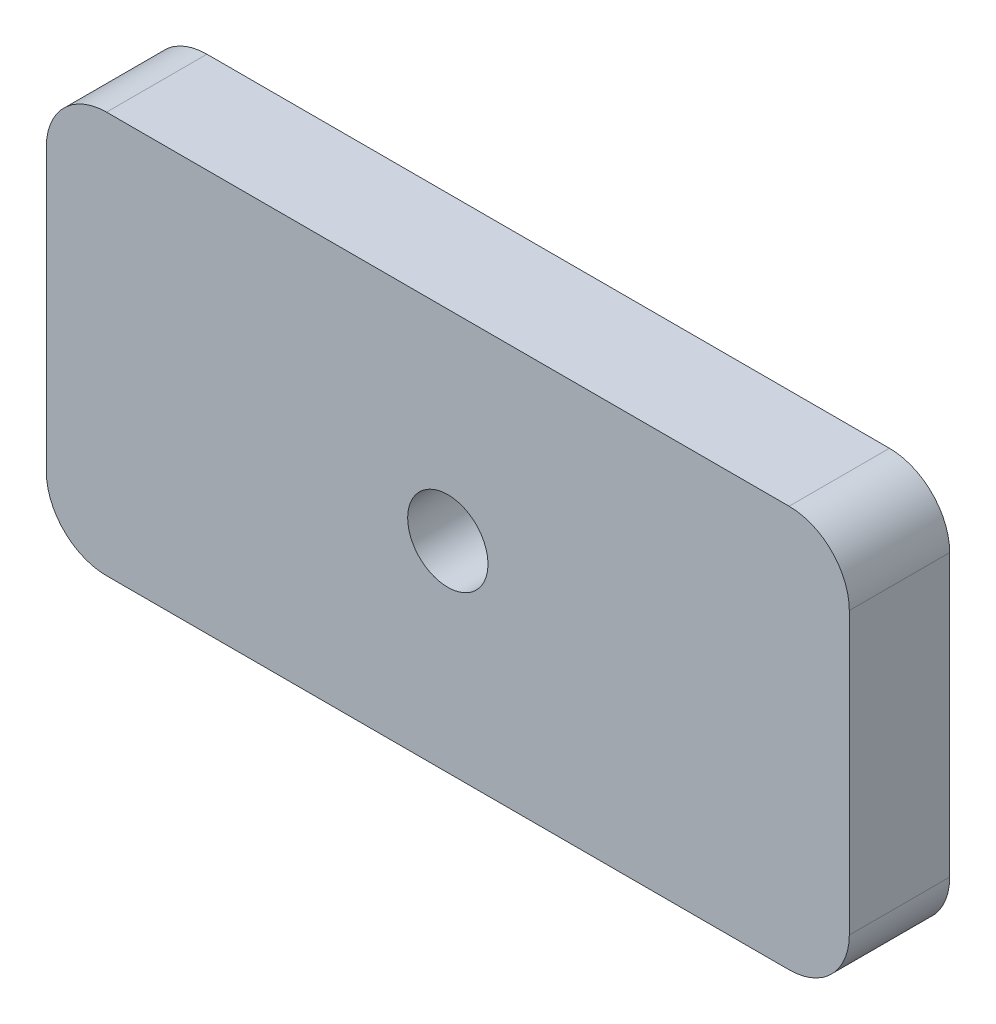
ISO-10303-21;
HEADER;
FILE_DESCRIPTION(('STEP AP214'),'2;1');
FILE_NAME('part.step','',(''),(''),'','','');
FILE_SCHEMA(('AUTOMOTIVE_DESIGN { 1 0 10303 214 1 1 1 1 }'));
ENDSEC;
DATA;
#1=APPLICATION_CONTEXT('core data for automotive mechanical design processes');
#2=APPLICATION_PROTOCOL_DEFINITION('international standard','automotive_design',2000,#1);
#3=PRODUCT_CONTEXT('',#1,'mechanical');
#4=PRODUCT('Part','Part','',(#3));
#5=PRODUCT_RELATED_PRODUCT_CATEGORY('part','',(#4));
#6=PRODUCT_DEFINITION_FORMATION('','',#4);
#7=PRODUCT_DEFINITION_CONTEXT('part definition',#1,'design');
#8=PRODUCT_DEFINITION('design','',#6,#7);
#9=PRODUCT_DEFINITION_SHAPE('','',#8);
#10=(LENGTH_UNIT() NAMED_UNIT(*) SI_UNIT(.MILLI.,.METRE.));
#11=(NAMED_UNIT(*) PLANE_ANGLE_UNIT() SI_UNIT($,.RADIAN.));
#12=(NAMED_UNIT(*) SI_UNIT($,.STERADIAN.) SOLID_ANGLE_UNIT());
#13=UNCERTAINTY_MEASURE_WITH_UNIT(LENGTH_MEASURE(1.E-05),#10,'distance_accuracy_value','');
#14=(GEOMETRIC_REPRESENTATION_CONTEXT(3) GLOBAL_UNCERTAINTY_ASSIGNED_CONTEXT((#13)) GLOBAL_UNIT_ASSIGNED_CONTEXT((#10,
#11,#12)) REPRESENTATION_CONTEXT('',''));
#15=CARTESIAN_POINT('',(0.,0.,0.));
#16=DIRECTION('',(0.,0.,1.));
#17=DIRECTION('',(1.,0.,0.));
#18=AXIS2_PLACEMENT_3D('',#15,#16,#17);
#19=CARTESIAN_POINT('',(-17.,-7.00000000000001,5.));
#20=DIRECTION('',(0.,0.,-1.));
#21=DIRECTION('',(-1.,0.,0.));
#22=AXIS2_PLACEMENT_3D('',#19,#20,#21);
#23=CYLINDRICAL_SURFACE('',#22,3.);
#24=CARTESIAN_POINT('',(-17.,-7.00000000000001,0.));
#25=DIRECTION('',(0.,0.,1.));
#26=DIRECTION('',(-1.,0.,0.));
#27=AXIS2_PLACEMENT_3D('',#24,#25,#26);
#28=CIRCLE('',#27,3.);
#29=CARTESIAN_POINT('',(-20.,-7.00000000000001,0.));
#30=VERTEX_POINT('',#29);
#31=CARTESIAN_POINT('',(-17.,-10.,0.));
#32=VERTEX_POINT('',#31);
#33=EDGE_CURVE('E140',#30,#32,#28,.T.);
#34=ORIENTED_EDGE('',*,*,#33,.T.);
#35=DIRECTION('',(0.,0.,-1.));
#36=VECTOR('',#35,1.);
#37=CARTESIAN_POINT('',(-17.,-10.,5.));
#38=LINE('',#37,#36);
#39=CARTESIAN_POINT('',(-17.,-10.,5.));
#40=VERTEX_POINT('',#39);
#41=EDGE_CURVE('E11',#40,#32,#38,.T.);
#42=ORIENTED_EDGE('',*,*,#41,.F.);
#43=CARTESIAN_POINT('',(-17.,-7.00000000000001,5.));
#44=DIRECTION('',(0.,0.,1.));
#45=DIRECTION('',(-1.,0.,0.));
#46=AXIS2_PLACEMENT_3D('',#43,#44,#45);
#47=CIRCLE('',#46,3.);
#48=CARTESIAN_POINT('',(-20.,-7.00000000000001,5.));
#49=VERTEX_POINT('',#48);
#50=EDGE_CURVE('E163',#49,#40,#47,.T.);
#51=ORIENTED_EDGE('',*,*,#50,.F.);
#52=DIRECTION('',(0.,0.,-1.));
#53=VECTOR('',#52,1.);
#54=CARTESIAN_POINT('',(-20.,-7.00000000000001,5.));
#55=LINE('',#54,#53);
#56=EDGE_CURVE('E136',#49,#30,#55,.T.);
#57=ORIENTED_EDGE('',*,*,#56,.T.);
#58=EDGE_LOOP('',(#34,#42,#51,#57));
#59=FACE_BOUND('',#58,.T.);
#60=ADVANCED_FACE('F39',(#59),#23,.T.);
#61=CARTESIAN_POINT('',(17.,-10.,5.));
#62=DIRECTION('',(0.,1.,0.));
#63=DIRECTION('',(-1.,0.,0.));
#64=AXIS2_PLACEMENT_3D('',#61,#62,#63);
#65=PLANE('',#64);
#66=DIRECTION('',(1.,0.,0.));
#67=VECTOR('',#66,1.);
#68=CARTESIAN_POINT('',(17.,-10.,0.));
#69=LINE('',#68,#67);
#70=CARTESIAN_POINT('',(17.,-10.,0.));
#71=VERTEX_POINT('',#70);
#72=EDGE_CURVE('E144',#32,#71,#69,.T.);
#73=ORIENTED_EDGE('',*,*,#72,.T.);
#74=DIRECTION('',(0.,0.,-1.));
#75=VECTOR('',#74,1.);
#76=CARTESIAN_POINT('',(17.,-10.,5.));
#77=LINE('',#76,#75);
#78=CARTESIAN_POINT('',(17.,-10.,5.));
#79=VERTEX_POINT('',#78);
#80=EDGE_CURVE('E48',#79,#71,#77,.T.);
#81=ORIENTED_EDGE('',*,*,#80,.F.);
#82=DIRECTION('',(1.,0.,0.));
#83=VECTOR('',#82,1.);
#84=CARTESIAN_POINT('',(17.,-10.,5.));
#85=LINE('',#84,#83);
#86=EDGE_CURVE('E99',#40,#79,#85,.T.);
#87=ORIENTED_EDGE('',*,*,#86,.F.);
#88=ORIENTED_EDGE('',*,*,#41,.T.);
#89=EDGE_LOOP('',(#73,#81,#87,#88));
#90=FACE_BOUND('',#89,.T.);
#91=ADVANCED_FACE('F230',(#90),#65,.F.);
#92=CARTESIAN_POINT('',(17.,-7.00000000000001,5.));
#93=DIRECTION('',(0.,0.,-1.));
#94=DIRECTION('',(-1.,0.,0.));
#95=AXIS2_PLACEMENT_3D('',#92,#93,#94);
#96=CYLINDRICAL_SURFACE('',#95,2.99999999999999);
#97=CARTESIAN_POINT('',(17.,-7.00000000000001,0.));
#98=DIRECTION('',(0.,0.,1.));
#99=DIRECTION('',(-1.,0.,0.));
#100=AXIS2_PLACEMENT_3D('',#97,#98,#99);
#101=CIRCLE('',#100,2.99999999999999);
#102=CARTESIAN_POINT('',(20.,-7.00000000000001,0.));
#103=VERTEX_POINT('',#102);
#104=EDGE_CURVE('E148',#71,#103,#101,.T.);
#105=ORIENTED_EDGE('',*,*,#104,.T.);
#106=DIRECTION('',(0.,0.,-1.));
#107=VECTOR('',#106,1.);
#108=CARTESIAN_POINT('',(20.,-7.00000000000001,5.));
#109=LINE('',#108,#107);
#110=CARTESIAN_POINT('',(20.,-7.00000000000001,5.));
#111=VERTEX_POINT('',#110);
#112=EDGE_CURVE('E174',#111,#103,#109,.T.);
#113=ORIENTED_EDGE('',*,*,#112,.F.);
#114=CARTESIAN_POINT('',(17.,-7.00000000000001,5.));
#115=DIRECTION('',(0.,0.,1.));
#116=DIRECTION('',(-1.,0.,0.));
#117=AXIS2_PLACEMENT_3D('',#114,#115,#116);
#118=CIRCLE('',#117,2.99999999999999);
#119=EDGE_CURVE('E184',#79,#111,#118,.T.);
#120=ORIENTED_EDGE('',*,*,#119,.F.);
#121=ORIENTED_EDGE('',*,*,#80,.T.);
#122=EDGE_LOOP('',(#105,#113,#120,#121));
#123=FACE_BOUND('',#122,.T.);
#124=ADVANCED_FACE('F182',(#123),#96,.T.);
#125=CARTESIAN_POINT('',(20.,7.00000000000001,5.));
#126=DIRECTION('',(-1.,0.,0.));
#127=DIRECTION('',(0.,0.,1.));
#128=AXIS2_PLACEMENT_3D('',#125,#126,#127);
#129=PLANE('',#128);
#130=DIRECTION('',(0.,1.,0.));
#131=VECTOR('',#130,1.);
#132=CARTESIAN_POINT('',(20.,7.00000000000001,0.));
#133=LINE('',#132,#131);
#134=CARTESIAN_POINT('',(20.,7.00000000000001,0.));
#135=VERTEX_POINT('',#134);
#136=EDGE_CURVE('E151',#103,#135,#133,.T.);
#137=ORIENTED_EDGE('',*,*,#136,.T.);
#138=DIRECTION('',(0.,0.,-1.));
#139=VECTOR('',#138,1.);
#140=CARTESIAN_POINT('',(20.,7.00000000000001,5.));
#141=LINE('',#140,#139);
#142=CARTESIAN_POINT('',(20.,7.00000000000001,5.));
#143=VERTEX_POINT('',#142);
#144=EDGE_CURVE('E170',#143,#135,#141,.T.);
#145=ORIENTED_EDGE('',*,*,#144,.F.);
#146=DIRECTION('',(0.,1.,0.));
#147=VECTOR('',#146,1.);
#148=CARTESIAN_POINT('',(20.,7.00000000000001,5.));
#149=LINE('',#148,#147);
#150=EDGE_CURVE('E197',#111,#143,#149,.T.);
#151=ORIENTED_EDGE('',*,*,#150,.F.);
#152=ORIENTED_EDGE('',*,*,#112,.T.);
#153=EDGE_LOOP('',(#137,#145,#151,#152));
#154=FACE_BOUND('',#153,.T.);
#155=ADVANCED_FACE('F192',(#154),#129,.F.);
#156=CARTESIAN_POINT('',(17.,7.00000000000001,5.));
#157=DIRECTION('',(0.,0.,-1.));
#158=DIRECTION('',(-1.,0.,0.));
#159=AXIS2_PLACEMENT_3D('',#156,#157,#158);
#160=CYLINDRICAL_SURFACE('',#159,2.99999999999999);
#161=CARTESIAN_POINT('',(17.,7.00000000000001,0.));
#162=DIRECTION('',(0.,0.,1.));
#163=DIRECTION('',(-1.,0.,0.));
#164=AXIS2_PLACEMENT_3D('',#161,#162,#163);
#165=CIRCLE('',#164,2.99999999999999);
#166=CARTESIAN_POINT('',(17.,10.,0.));
#167=VERTEX_POINT('',#166);
#168=EDGE_CURVE('E154',#135,#167,#165,.T.);
#169=ORIENTED_EDGE('',*,*,#168,.T.);
#170=DIRECTION('',(0.,0.,-1.));
#171=VECTOR('',#170,1.);
#172=CARTESIAN_POINT('',(17.,10.,5.));
#173=LINE('',#172,#171);
#174=CARTESIAN_POINT('',(17.,10.,5.));
#175=VERTEX_POINT('',#174);
#176=EDGE_CURVE('E129',#175,#167,#173,.T.);
#177=ORIENTED_EDGE('',*,*,#176,.F.);
#178=CARTESIAN_POINT('',(17.,7.00000000000001,5.));
#179=DIRECTION('',(0.,0.,1.));
#180=DIRECTION('',(-1.,0.,0.));
#181=AXIS2_PLACEMENT_3D('',#178,#179,#180);
#182=CIRCLE('',#181,2.99999999999999);
#183=EDGE_CURVE('E118',#143,#175,#182,.T.);
#184=ORIENTED_EDGE('',*,*,#183,.F.);
#185=ORIENTED_EDGE('',*,*,#144,.T.);
#186=EDGE_LOOP('',(#169,#177,#184,#185));
#187=FACE_BOUND('',#186,.T.);
#188=ADVANCED_FACE('F195',(#187),#160,.T.);
#189=CARTESIAN_POINT('',(17.,10.,5.));
#190=DIRECTION('',(0.,-1.,0.));
#191=DIRECTION('',(0.,0.,-1.));
#192=AXIS2_PLACEMENT_3D('',#189,#190,#191);
#193=PLANE('',#192);
#194=DIRECTION('',(-1.,0.,0.));
#195=VECTOR('',#194,1.);
#196=CARTESIAN_POINT('',(17.,10.,0.));
#197=LINE('',#196,#195);
#198=CARTESIAN_POINT('',(-17.,10.,0.));
#199=VERTEX_POINT('',#198);
#200=EDGE_CURVE('E127',#167,#199,#197,.T.);
#201=ORIENTED_EDGE('',*,*,#200,.T.);
#202=DIRECTION('',(0.,0.,-1.));
#203=VECTOR('',#202,1.);
#204=CARTESIAN_POINT('',(-17.,10.,5.));
#205=LINE('',#204,#203);
#206=CARTESIAN_POINT('',(-17.,10.,5.));
#207=VERTEX_POINT('',#206);
#208=EDGE_CURVE('E124',#207,#199,#205,.T.);
#209=ORIENTED_EDGE('',*,*,#208,.F.);
#210=DIRECTION('',(-1.,0.,0.));
#211=VECTOR('',#210,1.);
#212=CARTESIAN_POINT('',(17.,10.,5.));
#213=LINE('',#212,#211);
#214=EDGE_CURVE('E112',#175,#207,#213,.T.);
#215=ORIENTED_EDGE('',*,*,#214,.F.);
#216=ORIENTED_EDGE('',*,*,#176,.T.);
#217=EDGE_LOOP('',(#201,#209,#215,#216));
#218=FACE_BOUND('',#217,.T.);
#219=ADVANCED_FACE('F125',(#218),#193,.F.);
#220=CARTESIAN_POINT('',(-17.,7.00000000000001,5.));
#221=DIRECTION('',(0.,0.,-1.));
#222=DIRECTION('',(-1.,0.,0.));
#223=AXIS2_PLACEMENT_3D('',#220,#221,#222);
#224=CYLINDRICAL_SURFACE('',#223,2.99999999999999);
#225=CARTESIAN_POINT('',(-17.,7.00000000000001,0.));
#226=DIRECTION('',(0.,0.,1.));
#227=DIRECTION('',(1.,0.,0.));
#228=AXIS2_PLACEMENT_3D('',#225,#226,#227);
#229=CIRCLE('',#228,2.99999999999999);
#230=CARTESIAN_POINT('',(-20.,7.00000000000001,0.));
#231=VERTEX_POINT('',#230);
#232=EDGE_CURVE('E85',#199,#231,#229,.T.);
#233=ORIENTED_EDGE('',*,*,#232,.T.);
#234=DIRECTION('',(0.,0.,-1.));
#235=VECTOR('',#234,1.);
#236=CARTESIAN_POINT('',(-20.,7.00000000000001,5.));
#237=LINE('',#236,#235);
#238=CARTESIAN_POINT('',(-20.,7.00000000000001,5.));
#239=VERTEX_POINT('',#238);
#240=EDGE_CURVE('E130',#239,#231,#237,.T.);
#241=ORIENTED_EDGE('',*,*,#240,.F.);
#242=CARTESIAN_POINT('',(-17.,7.00000000000001,5.));
#243=DIRECTION('',(0.,0.,1.));
#244=DIRECTION('',(1.,0.,0.));
#245=AXIS2_PLACEMENT_3D('',#242,#243,#244);
#246=CIRCLE('',#245,2.99999999999999);
#247=EDGE_CURVE('E116',#207,#239,#246,.T.);
#248=ORIENTED_EDGE('',*,*,#247,.F.);
#249=ORIENTED_EDGE('',*,*,#208,.T.);
#250=EDGE_LOOP('',(#233,#241,#248,#249));
#251=FACE_BOUND('',#250,.T.);
#252=ADVANCED_FACE('F132',(#251),#224,.T.);
#253=CARTESIAN_POINT('',(-20.,7.00000000000001,5.));
#254=DIRECTION('',(1.,0.,0.));
#255=DIRECTION('',(0.,0.,-1.));
#256=AXIS2_PLACEMENT_3D('',#253,#254,#255);
#257=PLANE('',#256);
#258=DIRECTION('',(0.,-1.,0.));
#259=VECTOR('',#258,1.);
#260=CARTESIAN_POINT('',(-20.,7.00000000000001,0.));
#261=LINE('',#260,#259);
#262=EDGE_CURVE('E91',#231,#30,#261,.T.);
#263=ORIENTED_EDGE('',*,*,#262,.T.);
#264=ORIENTED_EDGE('',*,*,#56,.F.);
#265=DIRECTION('',(0.,-1.,0.));
#266=VECTOR('',#265,1.);
#267=CARTESIAN_POINT('',(-20.,7.00000000000001,5.));
#268=LINE('',#267,#266);
#269=EDGE_CURVE('E56',#239,#49,#268,.T.);
#270=ORIENTED_EDGE('',*,*,#269,.F.);
#271=ORIENTED_EDGE('',*,*,#240,.T.);
#272=EDGE_LOOP('',(#263,#264,#270,#271));
#273=FACE_BOUND('',#272,.T.);
#274=ADVANCED_FACE('F225',(#273),#257,.F.);
#275=CARTESIAN_POINT('',(-17.,-7.00000000000001,5.));
#276=DIRECTION('',(0.,0.,-1.));
#277=DIRECTION('',(-1.,0.,0.));
#278=AXIS2_PLACEMENT_3D('',#275,#276,#277);
#279=PLANE('',#278);
#280=CARTESIAN_POINT('',(0.,0.,5.));
#281=DIRECTION('',(0.,0.,-1.));
#282=DIRECTION('',(-1.,0.,0.));
#283=AXIS2_PLACEMENT_3D('',#280,#281,#282);
#284=CIRCLE('',#283,2.);
#285=CARTESIAN_POINT('',(-2.,0.,5.));
#286=VERTEX_POINT('',#285);
#287=EDGE_CURVE('E145',#286,#286,#284,.F.);
#288=ORIENTED_EDGE('',*,*,#287,.F.);
#289=EDGE_LOOP('',(#288));
#290=FACE_BOUND('',#289,.T.);
#291=ORIENTED_EDGE('',*,*,#50,.T.);
#292=ORIENTED_EDGE('',*,*,#86,.T.);
#293=ORIENTED_EDGE('',*,*,#119,.T.);
#294=ORIENTED_EDGE('',*,*,#150,.T.);
#295=ORIENTED_EDGE('',*,*,#183,.T.);
#296=ORIENTED_EDGE('',*,*,#214,.T.);
#297=ORIENTED_EDGE('',*,*,#247,.T.);
#298=ORIENTED_EDGE('',*,*,#269,.T.);
#299=EDGE_LOOP('',(#291,#292,#293,#294,#295,#296,#297,#298));
#300=FACE_BOUND('',#299,.T.);
#301=ADVANCED_FACE('F114',(#290,#300),#279,.F.);
#302=CARTESIAN_POINT('',(-17.,-7.00000000000001,0.));
#303=DIRECTION('',(0.,0.,-1.));
#304=DIRECTION('',(-1.,0.,0.));
#305=AXIS2_PLACEMENT_3D('',#302,#303,#304);
#306=PLANE('',#305);
#307=CARTESIAN_POINT('',(0.,0.,0.));
#308=DIRECTION('',(0.,0.,-1.));
#309=DIRECTION('',(-1.,0.,0.));
#310=AXIS2_PLACEMENT_3D('',#307,#308,#309);
#311=CIRCLE('',#310,2.);
#312=CARTESIAN_POINT('',(-2.,0.,0.));
#313=VERTEX_POINT('',#312);
#314=EDGE_CURVE('E210',#313,#313,#311,.T.);
#315=ORIENTED_EDGE('',*,*,#314,.F.);
#316=EDGE_LOOP('',(#315));
#317=FACE_BOUND('',#316,.T.);
#318=ORIENTED_EDGE('',*,*,#33,.F.);
#319=ORIENTED_EDGE('',*,*,#262,.F.);
#320=ORIENTED_EDGE('',*,*,#232,.F.);
#321=ORIENTED_EDGE('',*,*,#200,.F.);
#322=ORIENTED_EDGE('',*,*,#168,.F.);
#323=ORIENTED_EDGE('',*,*,#136,.F.);
#324=ORIENTED_EDGE('',*,*,#104,.F.);
#325=ORIENTED_EDGE('',*,*,#72,.F.);
#326=EDGE_LOOP('',(#318,#319,#320,#321,#322,#323,#324,#325));
#327=FACE_BOUND('',#326,.T.);
#328=ADVANCED_FACE('F188',(#317,#327),#306,.T.);
#329=CARTESIAN_POINT('',(0.,0.,5.001));
#330=DIRECTION('',(0.,0.,-1.));
#331=DIRECTION('',(-1.,0.,0.));
#332=AXIS2_PLACEMENT_3D('',#329,#330,#331);
#333=CYLINDRICAL_SURFACE('',#332,2.);
#334=ORIENTED_EDGE('',*,*,#314,.T.);
#335=EDGE_LOOP('',(#334));
#336=FACE_BOUND('',#335,.T.);
#337=ORIENTED_EDGE('',*,*,#287,.T.);
#338=EDGE_LOOP('',(#337));
#339=FACE_BOUND('',#338,.T.);
#340=ADVANCED_FACE('F215',(#336,#339),#333,.F.);
#341=CLOSED_SHELL('',(#60,#91,#124,#155,#188,#219,#252,#274,#301,#328,#340));
#342=MANIFOLD_SOLID_BREP('B2',#341);
#343=ADVANCED_BREP_SHAPE_REPRESENTATION('',(#18,#342),#14);
#344=SHAPE_DEFINITION_REPRESENTATION(#9,#343);
ENDSEC;
END-ISO-10303-21;
